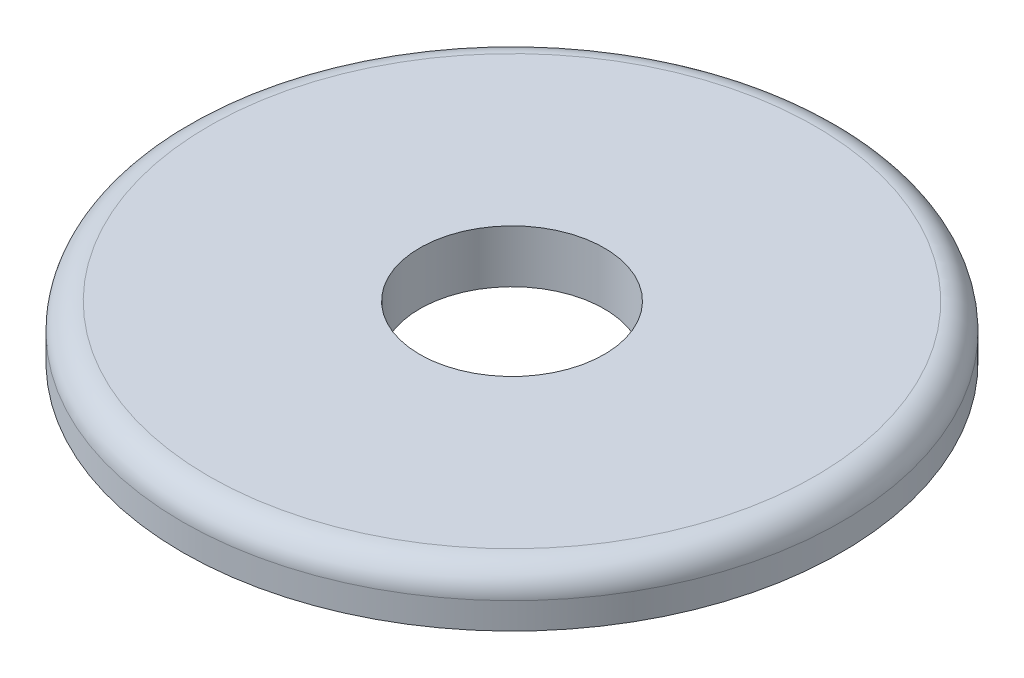
ISO-10303-21;
HEADER;
FILE_DESCRIPTION(('STEP AP214'),'2;1');
FILE_NAME('part.step','',(''),(''),'','','');
FILE_SCHEMA(('AUTOMOTIVE_DESIGN { 1 0 10303 214 1 1 1 1 }'));
ENDSEC;
DATA;
#1=APPLICATION_CONTEXT('core data for automotive mechanical design processes');
#2=APPLICATION_PROTOCOL_DEFINITION('international standard','automotive_design',2000,#1);
#3=PRODUCT_CONTEXT('',#1,'mechanical');
#4=PRODUCT('Part','Part','',(#3));
#5=PRODUCT_RELATED_PRODUCT_CATEGORY('part','',(#4));
#6=PRODUCT_DEFINITION_FORMATION('','',#4);
#7=PRODUCT_DEFINITION_CONTEXT('part definition',#1,'design');
#8=PRODUCT_DEFINITION('design','',#6,#7);
#9=PRODUCT_DEFINITION_SHAPE('','',#8);
#10=(LENGTH_UNIT() NAMED_UNIT(*) SI_UNIT(.MILLI.,.METRE.));
#11=(NAMED_UNIT(*) PLANE_ANGLE_UNIT() SI_UNIT($,.RADIAN.));
#12=(NAMED_UNIT(*) SI_UNIT($,.STERADIAN.) SOLID_ANGLE_UNIT());
#13=UNCERTAINTY_MEASURE_WITH_UNIT(LENGTH_MEASURE(1.E-05),#10,'distance_accuracy_value','');
#14=(GEOMETRIC_REPRESENTATION_CONTEXT(3) GLOBAL_UNCERTAINTY_ASSIGNED_CONTEXT((#13)) GLOBAL_UNIT_ASSIGNED_CONTEXT((#10,
#11,#12)) REPRESENTATION_CONTEXT('',''));
#15=CARTESIAN_POINT('',(0.,0.,0.));
#16=DIRECTION('',(0.,0.,1.));
#17=DIRECTION('',(1.,0.,0.));
#18=AXIS2_PLACEMENT_3D('',#15,#16,#17);
#19=CARTESIAN_POINT('',(0.,2.,0.));
#20=DIRECTION('',(0.,1.,0.));
#21=DIRECTION('',(0.,0.,1.));
#22=AXIS2_PLACEMENT_3D('',#19,#20,#21);
#23=PLANE('',#22);
#24=CARTESIAN_POINT('',(0.,2.,0.));
#25=DIRECTION('',(0.,1.,0.));
#26=DIRECTION('',(0.,0.,1.));
#27=AXIS2_PLACEMENT_3D('',#24,#25,#26);
#28=CIRCLE('',#27,11.5);
#29=CARTESIAN_POINT('',(0.,2.,11.5));
#30=VERTEX_POINT('',#29);
#31=EDGE_CURVE('E40',#30,#30,#28,.T.);
#32=ORIENTED_EDGE('',*,*,#31,.T.);
#33=EDGE_LOOP('',(#32));
#34=FACE_BOUND('',#33,.T.);
#35=CARTESIAN_POINT('',(0.,2.,0.));
#36=DIRECTION('',(0.,1.,0.));
#37=DIRECTION('',(0.,0.,1.));
#38=AXIS2_PLACEMENT_3D('',#35,#36,#37);
#39=CIRCLE('',#38,3.5);
#40=CARTESIAN_POINT('',(0.,2.,3.5));
#41=VERTEX_POINT('',#40);
#42=EDGE_CURVE('E48',#41,#41,#39,.T.);
#43=ORIENTED_EDGE('',*,*,#42,.F.);
#44=EDGE_LOOP('',(#43));
#45=FACE_BOUND('',#44,.T.);
#46=ADVANCED_FACE('F33',(#34,#45),#23,.T.);
#47=CARTESIAN_POINT('',(0.,0.,0.));
#48=DIRECTION('',(0.,1.,0.));
#49=DIRECTION('',(0.,0.,1.));
#50=AXIS2_PLACEMENT_3D('',#47,#48,#49);
#51=PLANE('',#50);
#52=CARTESIAN_POINT('',(0.,0.,0.));
#53=DIRECTION('',(0.,1.,0.));
#54=DIRECTION('',(0.,0.,1.));
#55=AXIS2_PLACEMENT_3D('',#52,#53,#54);
#56=CIRCLE('',#55,12.5);
#57=CARTESIAN_POINT('',(0.,0.,12.5));
#58=VERTEX_POINT('',#57);
#59=EDGE_CURVE('E44',#58,#58,#56,.T.);
#60=ORIENTED_EDGE('',*,*,#59,.F.);
#61=EDGE_LOOP('',(#60));
#62=FACE_BOUND('',#61,.T.);
#63=CARTESIAN_POINT('',(0.,0.,0.));
#64=DIRECTION('',(0.,1.,0.));
#65=DIRECTION('',(0.,0.,1.));
#66=AXIS2_PLACEMENT_3D('',#63,#64,#65);
#67=CIRCLE('',#66,3.5);
#68=CARTESIAN_POINT('',(0.,0.,3.5));
#69=VERTEX_POINT('',#68);
#70=EDGE_CURVE('E51',#69,#69,#67,.T.);
#71=ORIENTED_EDGE('',*,*,#70,.T.);
#72=EDGE_LOOP('',(#71));
#73=FACE_BOUND('',#72,.T.);
#74=ADVANCED_FACE('F61',(#62,#73),#51,.F.);
#75=CARTESIAN_POINT('',(0.,2.,0.));
#76=DIRECTION('',(0.,-1.,0.));
#77=DIRECTION('',(0.,0.,-1.));
#78=AXIS2_PLACEMENT_3D('',#75,#76,#77);
#79=CYLINDRICAL_SURFACE('',#78,12.5);
#80=CARTESIAN_POINT('',(0.,1.,0.));
#81=DIRECTION('',(0.,1.,0.));
#82=DIRECTION('',(0.,0.,1.));
#83=AXIS2_PLACEMENT_3D('',#80,#81,#82);
#84=CIRCLE('',#83,12.5);
#85=CARTESIAN_POINT('',(0.,1.,12.5));
#86=VERTEX_POINT('',#85);
#87=EDGE_CURVE('E10',#86,#86,#84,.F.);
#88=ORIENTED_EDGE('',*,*,#87,.T.);
#89=EDGE_LOOP('',(#88));
#90=FACE_BOUND('',#89,.T.);
#91=ORIENTED_EDGE('',*,*,#59,.T.);
#92=EDGE_LOOP('',(#91));
#93=FACE_BOUND('',#92,.T.);
#94=ADVANCED_FACE('F66',(#90,#93),#79,.T.);
#95=CARTESIAN_POINT('',(0.,2.,0.));
#96=DIRECTION('',(0.,-1.,0.));
#97=DIRECTION('',(0.,0.,-1.));
#98=AXIS2_PLACEMENT_3D('',#95,#96,#97);
#99=CYLINDRICAL_SURFACE('',#98,3.5);
#100=ORIENTED_EDGE('',*,*,#42,.T.);
#101=EDGE_LOOP('',(#100));
#102=FACE_BOUND('',#101,.T.);
#103=ORIENTED_EDGE('',*,*,#70,.F.);
#104=EDGE_LOOP('',(#103));
#105=FACE_BOUND('',#104,.T.);
#106=ADVANCED_FACE('F57',(#102,#105),#99,.F.);
#107=CARTESIAN_POINT('',(0.,1.,0.));
#108=DIRECTION('',(0.,1.,0.));
#109=DIRECTION('',(0.,0.,1.));
#110=AXIS2_PLACEMENT_3D('',#107,#108,#109);
#111=TOROIDAL_SURFACE('',#110,11.5,1.);
#112=ORIENTED_EDGE('',*,*,#87,.F.);
#113=EDGE_LOOP('',(#112));
#114=FACE_BOUND('',#113,.T.);
#115=ORIENTED_EDGE('',*,*,#31,.F.);
#116=EDGE_LOOP('',(#115));
#117=FACE_BOUND('',#116,.T.);
#118=ADVANCED_FACE('F35',(#114,#117),#111,.T.);
#119=CLOSED_SHELL('',(#46,#74,#94,#106,#118));
#120=MANIFOLD_SOLID_BREP('B2',#119);
#121=ADVANCED_BREP_SHAPE_REPRESENTATION('',(#18,#120),#14);
#122=SHAPE_DEFINITION_REPRESENTATION(#9,#121);
ENDSEC;
END-ISO-10303-21;
